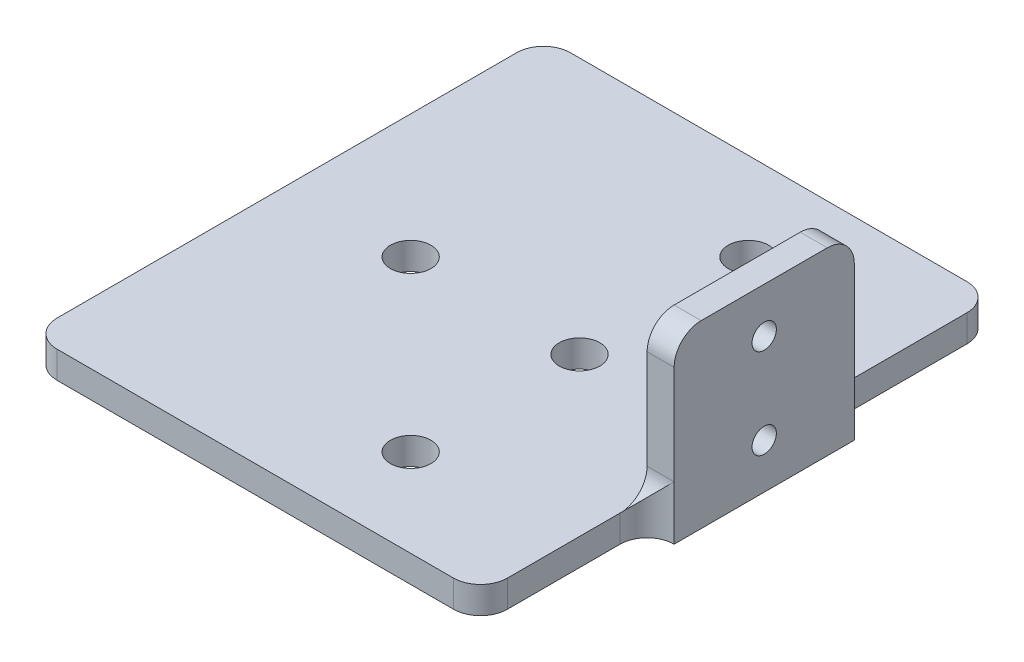
ISO-10303-21;
HEADER;
FILE_DESCRIPTION(('STEP AP214'),'2;1');
FILE_NAME('part.step','',(''),(''),'','','');
FILE_SCHEMA(('AUTOMOTIVE_DESIGN { 1 0 10303 214 1 1 1 1 }'));
ENDSEC;
DATA;
#1=APPLICATION_CONTEXT('core data for automotive mechanical design processes');
#2=APPLICATION_PROTOCOL_DEFINITION('international standard','automotive_design',2000,#1);
#3=PRODUCT_CONTEXT('',#1,'mechanical');
#4=PRODUCT('Part','Part','',(#3));
#5=PRODUCT_RELATED_PRODUCT_CATEGORY('part','',(#4));
#6=PRODUCT_DEFINITION_FORMATION('','',#4);
#7=PRODUCT_DEFINITION_CONTEXT('part definition',#1,'design');
#8=PRODUCT_DEFINITION('design','',#6,#7);
#9=PRODUCT_DEFINITION_SHAPE('','',#8);
#10=(LENGTH_UNIT() NAMED_UNIT(*) SI_UNIT(.MILLI.,.METRE.));
#11=(NAMED_UNIT(*) PLANE_ANGLE_UNIT() SI_UNIT($,.RADIAN.));
#12=(NAMED_UNIT(*) SI_UNIT($,.STERADIAN.) SOLID_ANGLE_UNIT());
#13=UNCERTAINTY_MEASURE_WITH_UNIT(LENGTH_MEASURE(1.E-05),#10,'distance_accuracy_value','');
#14=(GEOMETRIC_REPRESENTATION_CONTEXT(3) GLOBAL_UNCERTAINTY_ASSIGNED_CONTEXT((#13)) GLOBAL_UNIT_ASSIGNED_CONTEXT((#10,
#11,#12)) REPRESENTATION_CONTEXT('',''));
#15=CARTESIAN_POINT('',(0.,0.,0.));
#16=DIRECTION('',(0.,0.,1.));
#17=DIRECTION('',(1.,0.,0.));
#18=AXIS2_PLACEMENT_3D('',#15,#16,#17);
#19=CARTESIAN_POINT('',(25.,3.,-28.5));
#20=DIRECTION('',(-1.,0.,0.));
#21=DIRECTION('',(0.,0.,1.));
#22=AXIS2_PLACEMENT_3D('',#19,#20,#21);
#23=PLANE('',#22);
#24=DIRECTION('',(0.,0.,-1.));
#25=VECTOR('',#24,1.);
#26=CARTESIAN_POINT('',(25.,0.,-28.5));
#27=LINE('',#26,#25);
#28=CARTESIAN_POINT('',(25.,0.,-13.));
#29=VERTEX_POINT('',#28);
#30=CARTESIAN_POINT('',(25.,0.,-25.5));
#31=VERTEX_POINT('',#30);
#32=EDGE_CURVE('E239',#29,#31,#27,.T.);
#33=ORIENTED_EDGE('',*,*,#32,.T.);
#34=DIRECTION('',(0.,-1.,0.));
#35=VECTOR('',#34,1.);
#36=CARTESIAN_POINT('',(25.,3.,-25.5));
#37=LINE('',#36,#35);
#38=CARTESIAN_POINT('',(25.,3.,-25.5));
#39=VERTEX_POINT('',#38);
#40=EDGE_CURVE('E312',#31,#39,#37,.F.);
#41=ORIENTED_EDGE('',*,*,#40,.T.);
#42=DIRECTION('',(0.,0.,-1.));
#43=VECTOR('',#42,1.);
#44=CARTESIAN_POINT('',(25.,3.,-28.5));
#45=LINE('',#44,#43);
#46=CARTESIAN_POINT('',(25.,3.,-13.));
#47=VERTEX_POINT('',#46);
#48=EDGE_CURVE('E224',#47,#39,#45,.T.);
#49=ORIENTED_EDGE('',*,*,#48,.F.);
#50=DIRECTION('',(0.,1.,0.));
#51=VECTOR('',#50,1.);
#52=CARTESIAN_POINT('',(25.,0.,-13.));
#53=LINE('',#52,#51);
#54=EDGE_CURVE('E310',#47,#29,#53,.F.);
#55=ORIENTED_EDGE('',*,*,#54,.T.);
#56=EDGE_LOOP('',(#33,#41,#49,#55));
#57=FACE_BOUND('',#56,.T.);
#58=ADVANCED_FACE('F41',(#57),#23,.F.);
#59=CARTESIAN_POINT('',(25.,3.,25.5));
#60=VERTEX_POINT('',#59);
#61=CARTESIAN_POINT('',(25.,3.,13.));
#62=VERTEX_POINT('',#61);
#63=EDGE_CURVE('E229',#60,#62,#45,.T.);
#64=ORIENTED_EDGE('',*,*,#63,.F.);
#65=DIRECTION('',(0.,-1.,0.));
#66=VECTOR('',#65,1.);
#67=CARTESIAN_POINT('',(25.,3.,25.5));
#68=LINE('',#67,#66);
#69=CARTESIAN_POINT('',(25.,0.,25.5));
#70=VERTEX_POINT('',#69);
#71=EDGE_CURVE('E315',#60,#70,#68,.T.);
#72=ORIENTED_EDGE('',*,*,#71,.T.);
#73=CARTESIAN_POINT('',(25.,0.,13.));
#74=VERTEX_POINT('',#73);
#75=EDGE_CURVE('E242',#70,#74,#27,.T.);
#76=ORIENTED_EDGE('',*,*,#75,.T.);
#77=DIRECTION('',(0.,-1.,0.));
#78=VECTOR('',#77,1.);
#79=CARTESIAN_POINT('',(25.,3.,13.));
#80=LINE('',#79,#78);
#81=EDGE_CURVE('E174',#74,#62,#80,.F.);
#82=ORIENTED_EDGE('',*,*,#81,.T.);
#83=EDGE_LOOP('',(#64,#72,#76,#82));
#84=FACE_BOUND('',#83,.T.);
#85=ADVANCED_FACE('F364',(#84),#23,.F.);
#86=CARTESIAN_POINT('',(-25.,3.,-28.5));
#87=DIRECTION('',(0.,0.,1.));
#88=DIRECTION('',(1.,0.,0.));
#89=AXIS2_PLACEMENT_3D('',#86,#87,#88);
#90=PLANE('',#89);
#91=DIRECTION('',(-1.,0.,0.));
#92=VECTOR('',#91,1.);
#93=CARTESIAN_POINT('',(-25.,0.,-28.5));
#94=LINE('',#93,#92);
#95=CARTESIAN_POINT('',(22.,0.,-28.5));
#96=VERTEX_POINT('',#95);
#97=CARTESIAN_POINT('',(-22.,0.,-28.5));
#98=VERTEX_POINT('',#97);
#99=EDGE_CURVE('E243',#96,#98,#94,.T.);
#100=ORIENTED_EDGE('',*,*,#99,.T.);
#101=DIRECTION('',(0.,-1.,0.));
#102=VECTOR('',#101,1.);
#103=CARTESIAN_POINT('',(-22.,3.,-28.5));
#104=LINE('',#103,#102);
#105=CARTESIAN_POINT('',(-22.,3.,-28.5));
#106=VERTEX_POINT('',#105);
#107=EDGE_CURVE('E84',#98,#106,#104,.F.);
#108=ORIENTED_EDGE('',*,*,#107,.T.);
#109=DIRECTION('',(-1.,0.,0.));
#110=VECTOR('',#109,1.);
#111=CARTESIAN_POINT('',(-25.,3.,-28.5));
#112=LINE('',#111,#110);
#113=CARTESIAN_POINT('',(22.,3.,-28.5));
#114=VERTEX_POINT('',#113);
#115=EDGE_CURVE('E230',#114,#106,#112,.T.);
#116=ORIENTED_EDGE('',*,*,#115,.F.);
#117=DIRECTION('',(0.,-1.,0.));
#118=VECTOR('',#117,1.);
#119=CARTESIAN_POINT('',(22.,3.,-28.5));
#120=LINE('',#119,#118);
#121=EDGE_CURVE('E306',#114,#96,#120,.T.);
#122=ORIENTED_EDGE('',*,*,#121,.T.);
#123=EDGE_LOOP('',(#100,#108,#116,#122));
#124=FACE_BOUND('',#123,.T.);
#125=ADVANCED_FACE('F388',(#124),#90,.F.);
#126=CARTESIAN_POINT('',(-25.,3.,-28.5));
#127=DIRECTION('',(1.,0.,0.));
#128=DIRECTION('',(0.,0.,-1.));
#129=AXIS2_PLACEMENT_3D('',#126,#127,#128);
#130=PLANE('',#129);
#131=DIRECTION('',(0.,0.,1.));
#132=VECTOR('',#131,1.);
#133=CARTESIAN_POINT('',(-25.,0.,-28.5));
#134=LINE('',#133,#132);
#135=CARTESIAN_POINT('',(-25.,0.,-25.5));
#136=VERTEX_POINT('',#135);
#137=CARTESIAN_POINT('',(-25.,0.,25.5));
#138=VERTEX_POINT('',#137);
#139=EDGE_CURVE('E245',#136,#138,#134,.T.);
#140=ORIENTED_EDGE('',*,*,#139,.T.);
#141=DIRECTION('',(0.,-1.,0.));
#142=VECTOR('',#141,1.);
#143=CARTESIAN_POINT('',(-25.,3.,25.5));
#144=LINE('',#143,#142);
#145=CARTESIAN_POINT('',(-25.,3.,25.5));
#146=VERTEX_POINT('',#145);
#147=EDGE_CURVE('E296',#138,#146,#144,.F.);
#148=ORIENTED_EDGE('',*,*,#147,.T.);
#149=DIRECTION('',(0.,0.,1.));
#150=VECTOR('',#149,1.);
#151=CARTESIAN_POINT('',(-25.,3.,-28.5));
#152=LINE('',#151,#150);
#153=CARTESIAN_POINT('',(-25.,3.,-25.5));
#154=VERTEX_POINT('',#153);
#155=EDGE_CURVE('E232',#154,#146,#152,.T.);
#156=ORIENTED_EDGE('',*,*,#155,.F.);
#157=DIRECTION('',(0.,-1.,0.));
#158=VECTOR('',#157,1.);
#159=CARTESIAN_POINT('',(-25.,3.,-25.5));
#160=LINE('',#159,#158);
#161=EDGE_CURVE('E293',#154,#136,#160,.T.);
#162=ORIENTED_EDGE('',*,*,#161,.T.);
#163=EDGE_LOOP('',(#140,#148,#156,#162));
#164=FACE_BOUND('',#163,.T.);
#165=ADVANCED_FACE('F381',(#164),#130,.F.);
#166=CARTESIAN_POINT('',(-25.,3.,28.5));
#167=DIRECTION('',(0.,0.,-1.));
#168=DIRECTION('',(-1.,0.,0.));
#169=AXIS2_PLACEMENT_3D('',#166,#167,#168);
#170=PLANE('',#169);
#171=DIRECTION('',(1.,0.,0.));
#172=VECTOR('',#171,1.);
#173=CARTESIAN_POINT('',(-25.,3.,28.5));
#174=LINE('',#173,#172);
#175=CARTESIAN_POINT('',(-22.,3.,28.5));
#176=VERTEX_POINT('',#175);
#177=CARTESIAN_POINT('',(22.,3.,28.5));
#178=VERTEX_POINT('',#177);
#179=EDGE_CURVE('E235',#176,#178,#174,.T.);
#180=ORIENTED_EDGE('',*,*,#179,.F.);
#181=DIRECTION('',(0.,-1.,0.));
#182=VECTOR('',#181,1.);
#183=CARTESIAN_POINT('',(-22.,3.,28.5));
#184=LINE('',#183,#182);
#185=CARTESIAN_POINT('',(-22.,0.,28.5));
#186=VERTEX_POINT('',#185);
#187=EDGE_CURVE('E282',#176,#186,#184,.T.);
#188=ORIENTED_EDGE('',*,*,#187,.T.);
#189=DIRECTION('',(1.,0.,0.));
#190=VECTOR('',#189,1.);
#191=CARTESIAN_POINT('',(-25.,0.,28.5));
#192=LINE('',#191,#190);
#193=CARTESIAN_POINT('',(22.,0.,28.5));
#194=VERTEX_POINT('',#193);
#195=EDGE_CURVE('E228',#186,#194,#192,.T.);
#196=ORIENTED_EDGE('',*,*,#195,.T.);
#197=DIRECTION('',(0.,-1.,0.));
#198=VECTOR('',#197,1.);
#199=CARTESIAN_POINT('',(22.,3.,28.5));
#200=LINE('',#199,#198);
#201=EDGE_CURVE('E280',#194,#178,#200,.F.);
#202=ORIENTED_EDGE('',*,*,#201,.T.);
#203=EDGE_LOOP('',(#180,#188,#196,#202));
#204=FACE_BOUND('',#203,.T.);
#205=ADVANCED_FACE('F373',(#204),#170,.F.);
#206=CARTESIAN_POINT('',(0.,3.,0.));
#207=DIRECTION('',(0.,1.,0.));
#208=DIRECTION('',(0.,0.,1.));
#209=AXIS2_PLACEMENT_3D('',#206,#207,#208);
#210=PLANE('',#209);
#211=CARTESIAN_POINT('',(-11.25,3.,0.));
#212=DIRECTION('',(0.,1.,0.));
#213=DIRECTION('',(0.,0.,1.));
#214=AXIS2_PLACEMENT_3D('',#211,#212,#213);
#215=CIRCLE('',#214,2.25);
#216=CARTESIAN_POINT('',(-11.25,3.,2.25));
#217=VERTEX_POINT('',#216);
#218=EDGE_CURVE('E193',#217,#217,#215,.T.);
#219=ORIENTED_EDGE('',*,*,#218,.F.);
#220=EDGE_LOOP('',(#219));
#221=FACE_BOUND('',#220,.T.);
#222=CARTESIAN_POINT('',(7.5,3.,0.));
#223=DIRECTION('',(0.,1.,0.));
#224=DIRECTION('',(0.,0.,1.));
#225=AXIS2_PLACEMENT_3D('',#222,#223,#224);
#226=CIRCLE('',#225,2.25);
#227=CARTESIAN_POINT('',(7.5,3.,2.25));
#228=VERTEX_POINT('',#227);
#229=EDGE_CURVE('E212',#228,#228,#226,.T.);
#230=ORIENTED_EDGE('',*,*,#229,.F.);
#231=EDGE_LOOP('',(#230));
#232=FACE_BOUND('',#231,.T.);
#233=CARTESIAN_POINT('',(7.5,3.,-18.75));
#234=DIRECTION('',(0.,1.,0.));
#235=DIRECTION('',(0.,0.,1.));
#236=AXIS2_PLACEMENT_3D('',#233,#234,#235);
#237=CIRCLE('',#236,2.25);
#238=CARTESIAN_POINT('',(7.5,3.,-16.5));
#239=VERTEX_POINT('',#238);
#240=EDGE_CURVE('E216',#239,#239,#237,.T.);
#241=ORIENTED_EDGE('',*,*,#240,.F.);
#242=EDGE_LOOP('',(#241));
#243=FACE_BOUND('',#242,.T.);
#244=CARTESIAN_POINT('',(7.5,3.,18.75));
#245=DIRECTION('',(0.,1.,0.));
#246=DIRECTION('',(0.,0.,1.));
#247=AXIS2_PLACEMENT_3D('',#244,#245,#246);
#248=CIRCLE('',#247,2.25);
#249=CARTESIAN_POINT('',(7.5,3.,21.));
#250=VERTEX_POINT('',#249);
#251=EDGE_CURVE('E220',#250,#250,#248,.T.);
#252=ORIENTED_EDGE('',*,*,#251,.F.);
#253=EDGE_LOOP('',(#252));
#254=FACE_BOUND('',#253,.T.);
#255=ORIENTED_EDGE('',*,*,#63,.T.);
#256=EDGE_CURVE('E227',#62,#47,#45,.T.);
#257=ORIENTED_EDGE('',*,*,#256,.T.);
#258=ORIENTED_EDGE('',*,*,#48,.T.);
#259=CARTESIAN_POINT('',(22.,3.,-25.5));
#260=DIRECTION('',(0.,1.,0.));
#261=DIRECTION('',(0.,0.,1.));
#262=AXIS2_PLACEMENT_3D('',#259,#260,#261);
#263=CIRCLE('',#262,3.);
#264=EDGE_CURVE('E300',#39,#114,#263,.T.);
#265=ORIENTED_EDGE('',*,*,#264,.T.);
#266=ORIENTED_EDGE('',*,*,#115,.T.);
#267=CARTESIAN_POINT('',(-22.,3.,-25.5));
#268=DIRECTION('',(0.,1.,0.));
#269=DIRECTION('',(0.,0.,1.));
#270=AXIS2_PLACEMENT_3D('',#267,#268,#269);
#271=CIRCLE('',#270,3.);
#272=EDGE_CURVE('E302',#106,#154,#271,.T.);
#273=ORIENTED_EDGE('',*,*,#272,.T.);
#274=ORIENTED_EDGE('',*,*,#155,.T.);
#275=CARTESIAN_POINT('',(-22.,3.,25.5));
#276=DIRECTION('',(0.,1.,0.));
#277=DIRECTION('',(0.,0.,1.));
#278=AXIS2_PLACEMENT_3D('',#275,#276,#277);
#279=CIRCLE('',#278,3.);
#280=EDGE_CURVE('E304',#146,#176,#279,.T.);
#281=ORIENTED_EDGE('',*,*,#280,.T.);
#282=ORIENTED_EDGE('',*,*,#179,.T.);
#283=CARTESIAN_POINT('',(22.,3.,25.5));
#284=DIRECTION('',(0.,1.,0.));
#285=DIRECTION('',(0.,0.,1.));
#286=AXIS2_PLACEMENT_3D('',#283,#284,#285);
#287=CIRCLE('',#286,3.);
#288=EDGE_CURVE('E298',#178,#60,#287,.T.);
#289=ORIENTED_EDGE('',*,*,#288,.T.);
#290=EDGE_LOOP('',(#255,#257,#258,#265,#266,#273,#274,#281,#282,#289));
#291=FACE_BOUND('',#290,.T.);
#292=ADVANCED_FACE('F366',(#221,#232,#243,#254,#291),#210,.T.);
#293=CARTESIAN_POINT('',(0.,0.,0.));
#294=DIRECTION('',(0.,1.,0.));
#295=DIRECTION('',(0.,0.,1.));
#296=AXIS2_PLACEMENT_3D('',#293,#294,#295);
#297=PLANE('',#296);
#298=CARTESIAN_POINT('',(-11.25,0.,0.));
#299=DIRECTION('',(0.,1.,0.));
#300=DIRECTION('',(0.,0.,1.));
#301=AXIS2_PLACEMENT_3D('',#298,#299,#300);
#302=CIRCLE('',#301,2.25);
#303=CARTESIAN_POINT('',(-11.25,0.,2.25));
#304=VERTEX_POINT('',#303);
#305=EDGE_CURVE('E196',#304,#304,#302,.T.);
#306=ORIENTED_EDGE('',*,*,#305,.T.);
#307=EDGE_LOOP('',(#306));
#308=FACE_BOUND('',#307,.T.);
#309=CARTESIAN_POINT('',(7.5,0.,0.));
#310=DIRECTION('',(0.,1.,0.));
#311=DIRECTION('',(0.,0.,1.));
#312=AXIS2_PLACEMENT_3D('',#309,#310,#311);
#313=CIRCLE('',#312,2.25);
#314=CARTESIAN_POINT('',(7.5,0.,2.25));
#315=VERTEX_POINT('',#314);
#316=EDGE_CURVE('E215',#315,#315,#313,.T.);
#317=ORIENTED_EDGE('',*,*,#316,.T.);
#318=EDGE_LOOP('',(#317));
#319=FACE_BOUND('',#318,.T.);
#320=CARTESIAN_POINT('',(7.5,0.,-18.75));
#321=DIRECTION('',(0.,1.,0.));
#322=DIRECTION('',(0.,0.,1.));
#323=AXIS2_PLACEMENT_3D('',#320,#321,#322);
#324=CIRCLE('',#323,2.25);
#325=CARTESIAN_POINT('',(7.5,0.,-16.5));
#326=VERTEX_POINT('',#325);
#327=EDGE_CURVE('E219',#326,#326,#324,.T.);
#328=ORIENTED_EDGE('',*,*,#327,.T.);
#329=EDGE_LOOP('',(#328));
#330=FACE_BOUND('',#329,.T.);
#331=CARTESIAN_POINT('',(7.5,0.,18.75));
#332=DIRECTION('',(0.,1.,0.));
#333=DIRECTION('',(0.,0.,1.));
#334=AXIS2_PLACEMENT_3D('',#331,#332,#333);
#335=CIRCLE('',#334,2.25);
#336=CARTESIAN_POINT('',(7.5,0.,21.));
#337=VERTEX_POINT('',#336);
#338=EDGE_CURVE('E223',#337,#337,#335,.T.);
#339=ORIENTED_EDGE('',*,*,#338,.T.);
#340=EDGE_LOOP('',(#339));
#341=FACE_BOUND('',#340,.T.);
#342=ORIENTED_EDGE('',*,*,#195,.F.);
#343=CARTESIAN_POINT('',(-22.,0.,25.5));
#344=DIRECTION('',(0.,1.,0.));
#345=DIRECTION('',(0.,0.,1.));
#346=AXIS2_PLACEMENT_3D('',#343,#344,#345);
#347=CIRCLE('',#346,3.);
#348=EDGE_CURVE('E291',#186,#138,#347,.F.);
#349=ORIENTED_EDGE('',*,*,#348,.T.);
#350=ORIENTED_EDGE('',*,*,#139,.F.);
#351=CARTESIAN_POINT('',(-22.,0.,-25.5));
#352=DIRECTION('',(0.,1.,0.));
#353=DIRECTION('',(0.,0.,1.));
#354=AXIS2_PLACEMENT_3D('',#351,#352,#353);
#355=CIRCLE('',#354,3.);
#356=EDGE_CURVE('E289',#136,#98,#355,.F.);
#357=ORIENTED_EDGE('',*,*,#356,.T.);
#358=ORIENTED_EDGE('',*,*,#99,.F.);
#359=CARTESIAN_POINT('',(22.,0.,-25.5));
#360=DIRECTION('',(0.,1.,0.));
#361=DIRECTION('',(0.,0.,1.));
#362=AXIS2_PLACEMENT_3D('',#359,#360,#361);
#363=CIRCLE('',#362,3.);
#364=EDGE_CURVE('E287',#96,#31,#363,.F.);
#365=ORIENTED_EDGE('',*,*,#364,.T.);
#366=ORIENTED_EDGE('',*,*,#32,.F.);
#367=CARTESIAN_POINT('',(28.,0.,-13.));
#368=DIRECTION('',(0.,1.,0.));
#369=DIRECTION('',(0.,0.,1.));
#370=AXIS2_PLACEMENT_3D('',#367,#368,#369);
#371=CIRCLE('',#370,3.);
#372=CARTESIAN_POINT('',(28.,0.,-10.));
#373=VERTEX_POINT('',#372);
#374=EDGE_CURVE('E180',#29,#373,#371,.T.);
#375=ORIENTED_EDGE('',*,*,#374,.T.);
#376=DIRECTION('',(0.,0.,-1.));
#377=VECTOR('',#376,1.);
#378=CARTESIAN_POINT('',(28.,0.,9.99999999999999));
#379=LINE('',#378,#377);
#380=CARTESIAN_POINT('',(28.,0.,9.99999999999999));
#381=VERTEX_POINT('',#380);
#382=EDGE_CURVE('E184',#381,#373,#379,.T.);
#383=ORIENTED_EDGE('',*,*,#382,.F.);
#384=CARTESIAN_POINT('',(28.,0.,13.));
#385=DIRECTION('',(0.,1.,0.));
#386=DIRECTION('',(0.,0.,1.));
#387=AXIS2_PLACEMENT_3D('',#384,#385,#386);
#388=CIRCLE('',#387,3.);
#389=EDGE_CURVE('E171',#381,#74,#388,.T.);
#390=ORIENTED_EDGE('',*,*,#389,.T.);
#391=ORIENTED_EDGE('',*,*,#75,.F.);
#392=CARTESIAN_POINT('',(22.,0.,25.5));
#393=DIRECTION('',(0.,1.,0.));
#394=DIRECTION('',(0.,0.,1.));
#395=AXIS2_PLACEMENT_3D('',#392,#393,#394);
#396=CIRCLE('',#395,3.);
#397=EDGE_CURVE('E285',#70,#194,#396,.F.);
#398=ORIENTED_EDGE('',*,*,#397,.T.);
#399=EDGE_LOOP('',(#342,#349,#350,#357,#358,#365,#366,#375,#383,#390,#391,#398));
#400=FACE_BOUND('',#399,.T.);
#401=ADVANCED_FACE('F190',(#308,#319,#330,#341,#400),#297,.F.);
#402=CARTESIAN_POINT('',(7.5,3.,18.75));
#403=DIRECTION('',(0.,1.,0.));
#404=DIRECTION('',(0.,0.,1.));
#405=AXIS2_PLACEMENT_3D('',#402,#403,#404);
#406=CYLINDRICAL_SURFACE('',#405,2.25);
#407=ORIENTED_EDGE('',*,*,#251,.T.);
#408=EDGE_LOOP('',(#407));
#409=FACE_BOUND('',#408,.T.);
#410=ORIENTED_EDGE('',*,*,#338,.F.);
#411=EDGE_LOOP('',(#410));
#412=FACE_BOUND('',#411,.T.);
#413=ADVANCED_FACE('F569',(#409,#412),#406,.F.);
#414=CARTESIAN_POINT('',(7.5,3.,-18.75));
#415=DIRECTION('',(0.,1.,0.));
#416=DIRECTION('',(0.,0.,1.));
#417=AXIS2_PLACEMENT_3D('',#414,#415,#416);
#418=CYLINDRICAL_SURFACE('',#417,2.25);
#419=ORIENTED_EDGE('',*,*,#240,.T.);
#420=EDGE_LOOP('',(#419));
#421=FACE_BOUND('',#420,.T.);
#422=ORIENTED_EDGE('',*,*,#327,.F.);
#423=EDGE_LOOP('',(#422));
#424=FACE_BOUND('',#423,.T.);
#425=ADVANCED_FACE('F604',(#421,#424),#418,.F.);
#426=CARTESIAN_POINT('',(7.5,3.,0.));
#427=DIRECTION('',(0.,1.,0.));
#428=DIRECTION('',(0.,0.,1.));
#429=AXIS2_PLACEMENT_3D('',#426,#427,#428);
#430=CYLINDRICAL_SURFACE('',#429,2.25);
#431=ORIENTED_EDGE('',*,*,#229,.T.);
#432=EDGE_LOOP('',(#431));
#433=FACE_BOUND('',#432,.T.);
#434=ORIENTED_EDGE('',*,*,#316,.F.);
#435=EDGE_LOOP('',(#434));
#436=FACE_BOUND('',#435,.T.);
#437=ADVANCED_FACE('F596',(#433,#436),#430,.F.);
#438=CARTESIAN_POINT('',(-11.25,3.,0.));
#439=DIRECTION('',(0.,1.,0.));
#440=DIRECTION('',(0.,0.,1.));
#441=AXIS2_PLACEMENT_3D('',#438,#439,#440);
#442=CYLINDRICAL_SURFACE('',#441,2.25);
#443=ORIENTED_EDGE('',*,*,#218,.T.);
#444=EDGE_LOOP('',(#443));
#445=FACE_BOUND('',#444,.T.);
#446=ORIENTED_EDGE('',*,*,#305,.F.);
#447=EDGE_LOOP('',(#446));
#448=FACE_BOUND('',#447,.T.);
#449=ADVANCED_FACE('F500',(#445,#448),#442,.F.);
#450=CARTESIAN_POINT('',(28.,20.,-10.));
#451=DIRECTION('',(0.,0.,1.));
#452=DIRECTION('',(0.,-1.,0.));
#453=AXIS2_PLACEMENT_3D('',#450,#451,#452);
#454=PLANE('',#453);
#455=DIRECTION('',(0.,1.,0.));
#456=VECTOR('',#455,1.);
#457=CARTESIAN_POINT('',(28.,20.,-10.));
#458=LINE('',#457,#456);
#459=CARTESIAN_POINT('',(28.,6.,-10.));
#460=VERTEX_POINT('',#459);
#461=CARTESIAN_POINT('',(28.,17.,-10.));
#462=VERTEX_POINT('',#461);
#463=EDGE_CURVE('E208',#460,#462,#458,.T.);
#464=ORIENTED_EDGE('',*,*,#463,.F.);
#465=DIRECTION('',(-1.,0.,0.));
#466=VECTOR('',#465,1.);
#467=CARTESIAN_POINT('',(28.,6.,-10.));
#468=LINE('',#467,#466);
#469=CARTESIAN_POINT('',(25.,6.,-10.));
#470=VERTEX_POINT('',#469);
#471=EDGE_CURVE('E321',#460,#470,#468,.T.);
#472=ORIENTED_EDGE('',*,*,#471,.T.);
#473=DIRECTION('',(0.,1.,0.));
#474=VECTOR('',#473,1.);
#475=CARTESIAN_POINT('',(25.,20.,-10.));
#476=LINE('',#475,#474);
#477=CARTESIAN_POINT('',(25.,17.,-10.));
#478=VERTEX_POINT('',#477);
#479=EDGE_CURVE('E200',#470,#478,#476,.T.);
#480=ORIENTED_EDGE('',*,*,#479,.T.);
#481=DIRECTION('',(-1.,0.,0.));
#482=VECTOR('',#481,1.);
#483=CARTESIAN_POINT('',(28.,17.,-10.));
#484=LINE('',#483,#482);
#485=EDGE_CURVE('E270',#478,#462,#484,.F.);
#486=ORIENTED_EDGE('',*,*,#485,.T.);
#487=EDGE_LOOP('',(#464,#472,#480,#486));
#488=FACE_BOUND('',#487,.T.);
#489=ADVANCED_FACE('F339',(#488),#454,.F.);
#490=CARTESIAN_POINT('',(28.,20.,10.));
#491=DIRECTION('',(0.,-1.,0.));
#492=DIRECTION('',(0.,0.,-1.));
#493=AXIS2_PLACEMENT_3D('',#490,#491,#492);
#494=PLANE('',#493);
#495=DIRECTION('',(0.,0.,1.));
#496=VECTOR('',#495,1.);
#497=CARTESIAN_POINT('',(28.,20.,10.));
#498=LINE('',#497,#496);
#499=CARTESIAN_POINT('',(28.,20.,-7.));
#500=VERTEX_POINT('',#499);
#501=CARTESIAN_POINT('',(28.,20.,7.));
#502=VERTEX_POINT('',#501);
#503=EDGE_CURVE('E187',#500,#502,#498,.T.);
#504=ORIENTED_EDGE('',*,*,#503,.F.);
#505=DIRECTION('',(-1.,0.,0.));
#506=VECTOR('',#505,1.);
#507=CARTESIAN_POINT('',(28.,20.,-7.));
#508=LINE('',#507,#506);
#509=CARTESIAN_POINT('',(25.,20.,-7.));
#510=VERTEX_POINT('',#509);
#511=EDGE_CURVE('E262',#500,#510,#508,.T.);
#512=ORIENTED_EDGE('',*,*,#511,.T.);
#513=DIRECTION('',(0.,0.,1.));
#514=VECTOR('',#513,1.);
#515=CARTESIAN_POINT('',(25.,20.,10.));
#516=LINE('',#515,#514);
#517=CARTESIAN_POINT('',(25.,20.,7.));
#518=VERTEX_POINT('',#517);
#519=EDGE_CURVE('E202',#510,#518,#516,.T.);
#520=ORIENTED_EDGE('',*,*,#519,.T.);
#521=DIRECTION('',(-1.,0.,0.));
#522=VECTOR('',#521,1.);
#523=CARTESIAN_POINT('',(28.,20.,7.));
#524=LINE('',#523,#522);
#525=EDGE_CURVE('E238',#518,#502,#524,.F.);
#526=ORIENTED_EDGE('',*,*,#525,.T.);
#527=EDGE_LOOP('',(#504,#512,#520,#526));
#528=FACE_BOUND('',#527,.T.);
#529=ADVANCED_FACE('F491',(#528),#494,.F.);
#530=CARTESIAN_POINT('',(28.,20.,10.));
#531=DIRECTION('',(0.,0.,-1.));
#532=DIRECTION('',(0.,1.,0.));
#533=AXIS2_PLACEMENT_3D('',#530,#531,#532);
#534=PLANE('',#533);
#535=DIRECTION('',(0.,-1.,0.));
#536=VECTOR('',#535,1.);
#537=CARTESIAN_POINT('',(25.,20.,10.));
#538=LINE('',#537,#536);
#539=CARTESIAN_POINT('',(25.,17.,10.));
#540=VERTEX_POINT('',#539);
#541=CARTESIAN_POINT('',(25.,6.,9.99999999999999));
#542=VERTEX_POINT('',#541);
#543=EDGE_CURVE('E206',#540,#542,#538,.T.);
#544=ORIENTED_EDGE('',*,*,#543,.T.);
#545=DIRECTION('',(1.,0.,0.));
#546=VECTOR('',#545,1.);
#547=CARTESIAN_POINT('',(28.,6.,9.99999999999999));
#548=LINE('',#547,#546);
#549=CARTESIAN_POINT('',(28.,6.,9.99999999999999));
#550=VERTEX_POINT('',#549);
#551=EDGE_CURVE('E179',#542,#550,#548,.T.);
#552=ORIENTED_EDGE('',*,*,#551,.T.);
#553=DIRECTION('',(0.,-1.,0.));
#554=VECTOR('',#553,1.);
#555=CARTESIAN_POINT('',(28.,20.,10.));
#556=LINE('',#555,#554);
#557=CARTESIAN_POINT('',(28.,17.,10.));
#558=VERTEX_POINT('',#557);
#559=EDGE_CURVE('E186',#558,#550,#556,.T.);
#560=ORIENTED_EDGE('',*,*,#559,.F.);
#561=DIRECTION('',(-1.,0.,0.));
#562=VECTOR('',#561,1.);
#563=CARTESIAN_POINT('',(28.,17.,10.));
#564=LINE('',#563,#562);
#565=EDGE_CURVE('E277',#558,#540,#564,.T.);
#566=ORIENTED_EDGE('',*,*,#565,.T.);
#567=EDGE_LOOP('',(#544,#552,#560,#566));
#568=FACE_BOUND('',#567,.T.);
#569=ADVANCED_FACE('F356',(#568),#534,.F.);
#570=CARTESIAN_POINT('',(28.,0.,0.));
#571=DIRECTION('',(1.,0.,0.));
#572=DIRECTION('',(0.,0.,-1.));
#573=AXIS2_PLACEMENT_3D('',#570,#571,#572);
#574=PLANE('',#573);
#575=CARTESIAN_POINT('',(28.,15.,0.));
#576=DIRECTION('',(1.,0.,0.));
#577=DIRECTION('',(0.,0.,-1.));
#578=AXIS2_PLACEMENT_3D('',#575,#576,#577);
#579=CIRCLE('',#578,1.34999999999999);
#580=CARTESIAN_POINT('',(28.,15.,-1.34999999999999));
#581=VERTEX_POINT('',#580);
#582=EDGE_CURVE('E260',#581,#581,#579,.T.);
#583=ORIENTED_EDGE('',*,*,#582,.F.);
#584=EDGE_LOOP('',(#583));
#585=FACE_BOUND('',#584,.T.);
#586=CARTESIAN_POINT('',(28.,5.,0.));
#587=DIRECTION('',(1.,0.,0.));
#588=DIRECTION('',(0.,0.,-1.));
#589=AXIS2_PLACEMENT_3D('',#586,#587,#588);
#590=CIRCLE('',#589,1.34999999999999);
#591=CARTESIAN_POINT('',(28.,5.,-1.34999999999999));
#592=VERTEX_POINT('',#591);
#593=EDGE_CURVE('E259',#592,#592,#590,.T.);
#594=ORIENTED_EDGE('',*,*,#593,.F.);
#595=EDGE_LOOP('',(#594));
#596=FACE_BOUND('',#595,.T.);
#597=EDGE_CURVE('E56',#373,#460,#458,.T.);
#598=ORIENTED_EDGE('',*,*,#597,.T.);
#599=ORIENTED_EDGE('',*,*,#463,.T.);
#600=CARTESIAN_POINT('',(28.,17.,-7.));
#601=DIRECTION('',(1.,0.,0.));
#602=DIRECTION('',(0.,0.,-1.));
#603=AXIS2_PLACEMENT_3D('',#600,#601,#602);
#604=CIRCLE('',#603,3.);
#605=EDGE_CURVE('E275',#462,#500,#604,.T.);
#606=ORIENTED_EDGE('',*,*,#605,.T.);
#607=ORIENTED_EDGE('',*,*,#503,.T.);
#608=CARTESIAN_POINT('',(28.,17.,7.));
#609=DIRECTION('',(1.,0.,0.));
#610=DIRECTION('',(0.,0.,-1.));
#611=AXIS2_PLACEMENT_3D('',#608,#609,#610);
#612=CIRCLE('',#611,3.);
#613=EDGE_CURVE('E273',#502,#558,#612,.T.);
#614=ORIENTED_EDGE('',*,*,#613,.T.);
#615=ORIENTED_EDGE('',*,*,#559,.T.);
#616=EDGE_CURVE('E76',#550,#381,#556,.T.);
#617=ORIENTED_EDGE('',*,*,#616,.T.);
#618=ORIENTED_EDGE('',*,*,#382,.T.);
#619=EDGE_LOOP('',(#598,#599,#606,#607,#614,#615,#617,#618));
#620=FACE_BOUND('',#619,.T.);
#621=ADVANCED_FACE('F183',(#585,#596,#620),#574,.T.);
#622=CARTESIAN_POINT('',(25.,0.,0.));
#623=DIRECTION('',(1.,0.,0.));
#624=DIRECTION('',(0.,0.,-1.));
#625=AXIS2_PLACEMENT_3D('',#622,#623,#624);
#626=PLANE('',#625);
#627=CARTESIAN_POINT('',(25.,15.,0.));
#628=DIRECTION('',(1.,0.,0.));
#629=DIRECTION('',(0.,0.,-1.));
#630=AXIS2_PLACEMENT_3D('',#627,#628,#629);
#631=CIRCLE('',#630,1.34999999999999);
#632=CARTESIAN_POINT('',(25.,15.,-1.34999999999999));
#633=VERTEX_POINT('',#632);
#634=EDGE_CURVE('E256',#633,#633,#631,.T.);
#635=ORIENTED_EDGE('',*,*,#634,.T.);
#636=EDGE_LOOP('',(#635));
#637=FACE_BOUND('',#636,.T.);
#638=CARTESIAN_POINT('',(25.,5.,0.));
#639=DIRECTION('',(1.,0.,0.));
#640=DIRECTION('',(0.,0.,-1.));
#641=AXIS2_PLACEMENT_3D('',#638,#639,#640);
#642=CIRCLE('',#641,1.34999999999999);
#643=CARTESIAN_POINT('',(25.,5.,-1.34999999999999));
#644=VERTEX_POINT('',#643);
#645=EDGE_CURVE('E203',#644,#644,#642,.T.);
#646=ORIENTED_EDGE('',*,*,#645,.T.);
#647=EDGE_LOOP('',(#646));
#648=FACE_BOUND('',#647,.T.);
#649=ORIENTED_EDGE('',*,*,#519,.F.);
#650=CARTESIAN_POINT('',(25.,17.,-7.));
#651=DIRECTION('',(1.,0.,0.));
#652=DIRECTION('',(0.,0.,-1.));
#653=AXIS2_PLACEMENT_3D('',#650,#651,#652);
#654=CIRCLE('',#653,3.);
#655=EDGE_CURVE('E267',#510,#478,#654,.F.);
#656=ORIENTED_EDGE('',*,*,#655,.T.);
#657=ORIENTED_EDGE('',*,*,#479,.F.);
#658=CARTESIAN_POINT('',(25.,6.,-13.));
#659=DIRECTION('',(1.,0.,0.));
#660=DIRECTION('',(0.,0.,-1.));
#661=AXIS2_PLACEMENT_3D('',#658,#659,#660);
#662=CIRCLE('',#661,3.);
#663=EDGE_CURVE('E49',#470,#47,#662,.T.);
#664=ORIENTED_EDGE('',*,*,#663,.T.);
#665=ORIENTED_EDGE('',*,*,#256,.F.);
#666=CARTESIAN_POINT('',(25.,6.,13.));
#667=DIRECTION('',(1.,0.,0.));
#668=DIRECTION('',(0.,0.,-1.));
#669=AXIS2_PLACEMENT_3D('',#666,#667,#668);
#670=CIRCLE('',#669,3.);
#671=EDGE_CURVE('E325',#62,#542,#670,.T.);
#672=ORIENTED_EDGE('',*,*,#671,.T.);
#673=ORIENTED_EDGE('',*,*,#543,.F.);
#674=CARTESIAN_POINT('',(25.,17.,7.));
#675=DIRECTION('',(1.,0.,0.));
#676=DIRECTION('',(0.,0.,-1.));
#677=AXIS2_PLACEMENT_3D('',#674,#675,#676);
#678=CIRCLE('',#677,3.);
#679=EDGE_CURVE('E265',#540,#518,#678,.F.);
#680=ORIENTED_EDGE('',*,*,#679,.T.);
#681=EDGE_LOOP('',(#649,#656,#657,#664,#665,#672,#673,#680));
#682=FACE_BOUND('',#681,.T.);
#683=ADVANCED_FACE('F330',(#637,#648,#682),#626,.F.);
#684=CARTESIAN_POINT('',(28.,5.,0.));
#685=DIRECTION('',(1.,0.,0.));
#686=DIRECTION('',(0.,0.,-1.));
#687=AXIS2_PLACEMENT_3D('',#684,#685,#686);
#688=CYLINDRICAL_SURFACE('',#687,1.34999999999999);
#689=ORIENTED_EDGE('',*,*,#593,.T.);
#690=EDGE_LOOP('',(#689));
#691=FACE_BOUND('',#690,.T.);
#692=ORIENTED_EDGE('',*,*,#645,.F.);
#693=EDGE_LOOP('',(#692));
#694=FACE_BOUND('',#693,.T.);
#695=ADVANCED_FACE('F473',(#691,#694),#688,.F.);
#696=CARTESIAN_POINT('',(28.,15.,0.));
#697=DIRECTION('',(1.,0.,0.));
#698=DIRECTION('',(0.,0.,-1.));
#699=AXIS2_PLACEMENT_3D('',#696,#697,#698);
#700=CYLINDRICAL_SURFACE('',#699,1.34999999999999);
#701=ORIENTED_EDGE('',*,*,#582,.T.);
#702=EDGE_LOOP('',(#701));
#703=FACE_BOUND('',#702,.T.);
#704=ORIENTED_EDGE('',*,*,#634,.F.);
#705=EDGE_LOOP('',(#704));
#706=FACE_BOUND('',#705,.T.);
#707=ADVANCED_FACE('F412',(#703,#706),#700,.F.);
#708=CARTESIAN_POINT('',(28.,17.,-7.));
#709=DIRECTION('',(-1.,0.,0.));
#710=DIRECTION('',(0.,0.,1.));
#711=AXIS2_PLACEMENT_3D('',#708,#709,#710);
#712=CYLINDRICAL_SURFACE('',#711,3.);
#713=ORIENTED_EDGE('',*,*,#605,.F.);
#714=ORIENTED_EDGE('',*,*,#485,.F.);
#715=ORIENTED_EDGE('',*,*,#655,.F.);
#716=ORIENTED_EDGE('',*,*,#511,.F.);
#717=EDGE_LOOP('',(#713,#714,#715,#716));
#718=FACE_BOUND('',#717,.T.);
#719=ADVANCED_FACE('F409',(#718),#712,.T.);
#720=CARTESIAN_POINT('',(28.,17.,7.));
#721=DIRECTION('',(-1.,0.,0.));
#722=DIRECTION('',(0.,0.,1.));
#723=AXIS2_PLACEMENT_3D('',#720,#721,#722);
#724=CYLINDRICAL_SURFACE('',#723,3.);
#725=ORIENTED_EDGE('',*,*,#613,.F.);
#726=ORIENTED_EDGE('',*,*,#525,.F.);
#727=ORIENTED_EDGE('',*,*,#679,.F.);
#728=ORIENTED_EDGE('',*,*,#565,.F.);
#729=EDGE_LOOP('',(#725,#726,#727,#728));
#730=FACE_BOUND('',#729,.T.);
#731=ADVANCED_FACE('F353',(#730),#724,.T.);
#732=CARTESIAN_POINT('',(-22.,3.,25.5));
#733=DIRECTION('',(0.,-1.,0.));
#734=DIRECTION('',(0.,0.,-1.));
#735=AXIS2_PLACEMENT_3D('',#732,#733,#734);
#736=CYLINDRICAL_SURFACE('',#735,3.);
#737=ORIENTED_EDGE('',*,*,#280,.F.);
#738=ORIENTED_EDGE('',*,*,#147,.F.);
#739=ORIENTED_EDGE('',*,*,#348,.F.);
#740=ORIENTED_EDGE('',*,*,#187,.F.);
#741=EDGE_LOOP('',(#737,#738,#739,#740));
#742=FACE_BOUND('',#741,.T.);
#743=ADVANCED_FACE('F377',(#742),#736,.T.);
#744=CARTESIAN_POINT('',(-22.,3.,-25.5));
#745=DIRECTION('',(0.,-1.,0.));
#746=DIRECTION('',(0.,0.,-1.));
#747=AXIS2_PLACEMENT_3D('',#744,#745,#746);
#748=CYLINDRICAL_SURFACE('',#747,3.);
#749=ORIENTED_EDGE('',*,*,#272,.F.);
#750=ORIENTED_EDGE('',*,*,#107,.F.);
#751=ORIENTED_EDGE('',*,*,#356,.F.);
#752=ORIENTED_EDGE('',*,*,#161,.F.);
#753=EDGE_LOOP('',(#749,#750,#751,#752));
#754=FACE_BOUND('',#753,.T.);
#755=ADVANCED_FACE('F386',(#754),#748,.T.);
#756=CARTESIAN_POINT('',(22.,3.,-25.5));
#757=DIRECTION('',(0.,-1.,0.));
#758=DIRECTION('',(0.,0.,-1.));
#759=AXIS2_PLACEMENT_3D('',#756,#757,#758);
#760=CYLINDRICAL_SURFACE('',#759,3.);
#761=ORIENTED_EDGE('',*,*,#264,.F.);
#762=ORIENTED_EDGE('',*,*,#40,.F.);
#763=ORIENTED_EDGE('',*,*,#364,.F.);
#764=ORIENTED_EDGE('',*,*,#121,.F.);
#765=EDGE_LOOP('',(#761,#762,#763,#764));
#766=FACE_BOUND('',#765,.T.);
#767=ADVANCED_FACE('F391',(#766),#760,.T.);
#768=CARTESIAN_POINT('',(28.,20.,-13.));
#769=DIRECTION('',(0.,-1.,0.));
#770=DIRECTION('',(0.,0.,-1.));
#771=AXIS2_PLACEMENT_3D('',#768,#769,#770);
#772=CYLINDRICAL_SURFACE('',#771,3.);
#773=ORIENTED_EDGE('',*,*,#374,.F.);
#774=ORIENTED_EDGE('',*,*,#54,.F.);
#775=CARTESIAN_POINT('',(28.,6.,-13.));
#776=DIRECTION('',(0.707106781186547,-0.707106781186547,0.));
#777=DIRECTION('',(-0.707106781186547,-0.707106781186547,0.));
#778=AXIS2_PLACEMENT_3D('',#775,#776,#777);
#779=ELLIPSE('',#778,4.24264068711928,3.);
#780=EDGE_CURVE('E11',#47,#460,#779,.F.);
#781=ORIENTED_EDGE('',*,*,#780,.T.);
#782=ORIENTED_EDGE('',*,*,#597,.F.);
#783=EDGE_LOOP('',(#773,#774,#781,#782));
#784=FACE_BOUND('',#783,.T.);
#785=ADVANCED_FACE('F337',(#784),#772,.F.);
#786=CARTESIAN_POINT('',(22.,3.,25.5));
#787=DIRECTION('',(0.,-1.,0.));
#788=DIRECTION('',(0.,0.,-1.));
#789=AXIS2_PLACEMENT_3D('',#786,#787,#788);
#790=CYLINDRICAL_SURFACE('',#789,3.);
#791=ORIENTED_EDGE('',*,*,#288,.F.);
#792=ORIENTED_EDGE('',*,*,#201,.F.);
#793=ORIENTED_EDGE('',*,*,#397,.F.);
#794=ORIENTED_EDGE('',*,*,#71,.F.);
#795=EDGE_LOOP('',(#791,#792,#793,#794));
#796=FACE_BOUND('',#795,.T.);
#797=ADVANCED_FACE('F371',(#796),#790,.T.);
#798=CARTESIAN_POINT('',(28.,20.,13.));
#799=DIRECTION('',(0.,1.,0.));
#800=DIRECTION('',(0.,0.,1.));
#801=AXIS2_PLACEMENT_3D('',#798,#799,#800);
#802=CYLINDRICAL_SURFACE('',#801,3.);
#803=ORIENTED_EDGE('',*,*,#616,.F.);
#804=CARTESIAN_POINT('',(28.,6.,13.));
#805=DIRECTION('',(-0.707106781186547,0.707106781186547,0.));
#806=DIRECTION('',(0.707106781186547,0.707106781186547,0.));
#807=AXIS2_PLACEMENT_3D('',#804,#805,#806);
#808=ELLIPSE('',#807,4.24264068711928,3.);
#809=EDGE_CURVE('E323',#550,#62,#808,.T.);
#810=ORIENTED_EDGE('',*,*,#809,.T.);
#811=ORIENTED_EDGE('',*,*,#81,.F.);
#812=ORIENTED_EDGE('',*,*,#389,.F.);
#813=EDGE_LOOP('',(#803,#810,#811,#812));
#814=FACE_BOUND('',#813,.T.);
#815=ADVANCED_FACE('F172',(#814),#802,.F.);
#816=CARTESIAN_POINT('',(28.,6.,13.));
#817=DIRECTION('',(1.,0.,0.));
#818=DIRECTION('',(0.,0.,-1.));
#819=AXIS2_PLACEMENT_3D('',#816,#817,#818);
#820=CYLINDRICAL_SURFACE('',#819,3.);
#821=ORIENTED_EDGE('',*,*,#551,.F.);
#822=ORIENTED_EDGE('',*,*,#671,.F.);
#823=ORIENTED_EDGE('',*,*,#809,.F.);
#824=EDGE_LOOP('',(#821,#822,#823));
#825=FACE_BOUND('',#824,.T.);
#826=ADVANCED_FACE('F360',(#825),#820,.F.);
#827=CARTESIAN_POINT('',(28.,6.,-13.));
#828=DIRECTION('',(-1.,0.,0.));
#829=DIRECTION('',(0.,0.,1.));
#830=AXIS2_PLACEMENT_3D('',#827,#828,#829);
#831=CYLINDRICAL_SURFACE('',#830,3.);
#832=ORIENTED_EDGE('',*,*,#471,.F.);
#833=ORIENTED_EDGE('',*,*,#780,.F.);
#834=ORIENTED_EDGE('',*,*,#663,.F.);
#835=EDGE_LOOP('',(#832,#833,#834));
#836=FACE_BOUND('',#835,.T.);
#837=ADVANCED_FACE('F43',(#836),#831,.F.);
#838=CLOSED_SHELL('',(#58,#85,#125,#165,#205,#292,#401,#413,#425,#437,#449,#489,#529,#569,#621,
#683,#695,#707,#719,#731,#743,#755,#767,#785,#797,#815,#826,#837));
#839=MANIFOLD_SOLID_BREP('B2',#838);
#840=ADVANCED_BREP_SHAPE_REPRESENTATION('',(#18,#839),#14);
#841=SHAPE_DEFINITION_REPRESENTATION(#9,#840);
ENDSEC;
END-ISO-10303-21;
